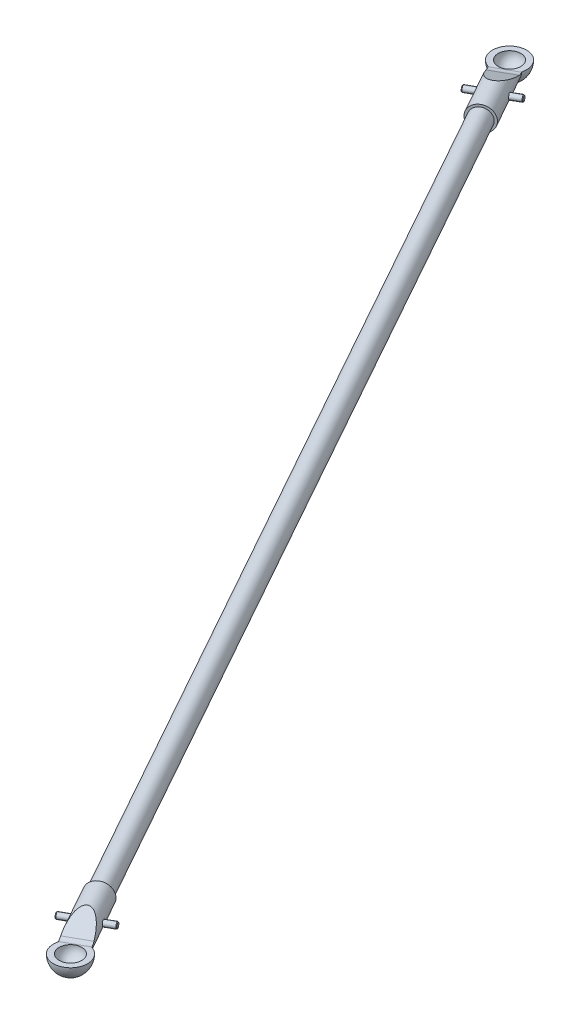
ISO-10303-21;
HEADER;
FILE_DESCRIPTION(('STEP AP214'),'2;1');
FILE_NAME('part.step','',(''),(''),'','','');
FILE_SCHEMA(('AUTOMOTIVE_DESIGN { 1 0 10303 214 1 1 1 1 }'));
ENDSEC;
DATA;
#1=APPLICATION_CONTEXT('core data for automotive mechanical design processes');
#2=APPLICATION_PROTOCOL_DEFINITION('international standard','automotive_design',2000,#1);
#3=PRODUCT_CONTEXT('',#1,'mechanical');
#4=PRODUCT('Part','Part','',(#3));
#5=PRODUCT_RELATED_PRODUCT_CATEGORY('part','',(#4));
#6=PRODUCT_DEFINITION_FORMATION('','',#4);
#7=PRODUCT_DEFINITION_CONTEXT('part definition',#1,'design');
#8=PRODUCT_DEFINITION('design','',#6,#7);
#9=PRODUCT_DEFINITION_SHAPE('','',#8);
#10=(LENGTH_UNIT() NAMED_UNIT(*) SI_UNIT(.MILLI.,.METRE.));
#11=(NAMED_UNIT(*) PLANE_ANGLE_UNIT() SI_UNIT($,.RADIAN.));
#12=(NAMED_UNIT(*) SI_UNIT($,.STERADIAN.) SOLID_ANGLE_UNIT());
#13=UNCERTAINTY_MEASURE_WITH_UNIT(LENGTH_MEASURE(1.E-05),#10,'distance_accuracy_value','');
#14=(GEOMETRIC_REPRESENTATION_CONTEXT(3) GLOBAL_UNCERTAINTY_ASSIGNED_CONTEXT((#13)) GLOBAL_UNIT_ASSIGNED_CONTEXT((#10,
#11,#12)) REPRESENTATION_CONTEXT('',''));
#15=CARTESIAN_POINT('',(0.,0.,0.));
#16=DIRECTION('',(0.,0.,1.));
#17=DIRECTION('',(1.,0.,0.));
#18=AXIS2_PLACEMENT_3D('',#15,#16,#17);
#19=CARTESIAN_POINT('',(45.0999933752008,-50.9999947127485,-973.470500816511));
#20=DIRECTION('',(-0.487374986066847,6.28174157559984E-09,-0.873192775368842));
#21=DIRECTION('',(0.873192775368841,-4.87641980152789E-08,-0.487374986066847));
#22=AXIS2_PLACEMENT_3D('',#19,#20,#21);
#23=CYLINDRICAL_SURFACE('',#22,8.65);
#24=CARTESIAN_POINT('',(70.6871801437103,-50.9999950425399,-927.627880109647));
#25=DIRECTION('',(-0.487374986066847,6.28174157559984E-09,-0.873192775368842));
#26=DIRECTION('',(0.873192775368841,-4.87641980152789E-08,-0.487374986066847));
#27=AXIS2_PLACEMENT_3D('',#24,#25,#26);
#28=CIRCLE('',#27,8.65);
#29=CARTESIAN_POINT('',(78.2402976506508,-50.9999954643502,-931.843673739125));
#30=VERTEX_POINT('',#29);
#31=EDGE_CURVE('P0_E53',#30,#30,#28,.T.);
#32=ORIENTED_EDGE('',*,*,#31,.T.);
#33=EDGE_LOOP('',(#32));
#34=FACE_BOUND('',#33,.T.);
#35=DIRECTION('',(-0.487374986066847,6.28174157559984E-09,-0.873192775368842));
#36=VECTOR('',#35,1.);
#37=CARTESIAN_POINT('',(52.6531108821413,-50.9999951345588,-977.68629444599));
#38=LINE('',#37,#36);
#39=CARTESIAN_POINT('',(56.8383724384136,-50.9999951885023,-970.187878937515));
#40=VERTEX_POINT('',#39);
#41=CARTESIAN_POINT('',(56.7067554605346,-50.9999951868059,-970.423687088293));
#42=VERTEX_POINT('',#41);
#43=EDGE_CURVE('P0_E37',#40,#42,#38,.T.);
#44=ORIENTED_EDGE('',*,*,#43,.F.);
#45=CARTESIAN_POINT('',(58.7107339586362,-50.2050437457864,-966.758202004159));
#46=CARTESIAN_POINT('',(58.6519230387866,-50.2601281611182,-966.873992426591));
#47=CARTESIAN_POINT('',(58.5918617909083,-50.3124703869534,-966.990426955373));
#48=CARTESIAN_POINT('',(58.4695920484234,-50.4115821716905,-967.224530459192));
#49=CARTESIAN_POINT('',(58.4073836022395,-50.4583518561564,-967.342199406349));
#50=CARTESIAN_POINT('',(58.2180281238374,-50.5901978340027,-967.697051367531));
#51=CARTESIAN_POINT('',(58.088184298144,-50.666780089165,-967.936014565995));
#52=CARTESIAN_POINT('',(57.8261527380544,-50.795585420593,-968.413674911189));
#53=CARTESIAN_POINT('',(57.6940394417109,-50.8481909339613,-968.652310914288));
#54=CARTESIAN_POINT('',(57.4274772808251,-50.9305083003875,-969.132054845924));
#55=CARTESIAN_POINT('',(57.2930300818904,-50.9602358449463,-969.373160965045));
#56=CARTESIAN_POINT('',(57.10506175091,-50.9856106499495,-969.710051208476));
#57=CARTESIAN_POINT('',(57.0518690153384,-50.9909936391567,-969.805365241598));
#58=CARTESIAN_POINT('',(56.9452430795453,-50.9981914896029,-969.996408079282));
#59=CARTESIAN_POINT('',(56.8918096662581,-50.9999944785431,-970.092137212299));
#60=CARTESIAN_POINT('',(56.8383724384136,-50.9999951885023,-970.187878937515));
#61=B_SPLINE_CURVE_WITH_KNOTS('',3,(#45,#46,#47,#48,#49,#50,#51,#52,#53,#54,#55,#56,#57,#58,#59,
#60),.UNSPECIFIED.,.F.,.F.,(4,2,2,2,2,2,2,4),(0.,0.423133087806717,0.846256639519644,
1.69274082725032,2.52520527690246,3.35709824718313,3.68490727157546,4.01380160023117),.UNSPECIFIED.);
#62=CARTESIAN_POINT('',(58.7107339586362,-50.2050437457864,-966.758202004159));
#63=VERTEX_POINT('',#62);
#64=EDGE_CURVE('P0_E25',#63,#40,#61,.T.);
#65=ORIENTED_EDGE('',*,*,#64,.F.);
#66=CARTESIAN_POINT('',(50.2768305474421,-50.9999947794724,-964.195554528148));
#67=DIRECTION('',(-0.190432536289561,0.920504855906911,-0.341183615336556));
#68=DIRECTION('',(-0.448631057959641,-0.3907311227069,-0.80377818058356));
#69=AXIS2_PLACEMENT_3D('',#66,#67,#68);
#70=ELLIPSE('',#69,22.1379853543904,8.65);
#71=CARTESIAN_POINT('',(43.6684275429436,-50.2050429057359,-958.36229667081));
#72=VERTEX_POINT('',#71);
#73=EDGE_CURVE('P0_E62',#72,#63,#70,.T.);
#74=ORIENTED_EDGE('',*,*,#73,.F.);
#75=CARTESIAN_POINT('',(41.7321374245327,-50.9999943448817,-961.756291678559));
#76=CARTESIAN_POINT('',(41.8008894884692,-50.9999940396881,-961.633123823543));
#77=CARTESIAN_POINT('',(41.8696237049313,-50.99700923562,-961.509966620842));
#78=CARTESIAN_POINT('',(42.0069887747402,-50.9850776532978,-961.263881702194));
#79=CARTESIAN_POINT('',(42.0756196268604,-50.9761308048418,-961.140953988967));
#80=CARTESIAN_POINT('',(42.2813154485149,-50.9403470054942,-960.77272028693));
#81=CARTESIAN_POINT('',(42.4181211239722,-50.9045668112656,-960.528075967531));
#82=CARTESIAN_POINT('',(42.6884425154102,-50.8102327761976,-960.046966579548));
#83=CARTESIAN_POINT('',(42.8219749640065,-50.752070277859,-959.810433146439));
#84=CARTESIAN_POINT('',(43.0882833400432,-50.6133943728722,-959.343751119846));
#85=CARTESIAN_POINT('',(43.2210597591028,-50.5328977355128,-959.113597877934));
#86=CARTESIAN_POINT('',(43.4061103519268,-50.4055471433689,-958.798968186177));
#87=CARTESIAN_POINT('',(43.4584179765678,-50.3678595375368,-958.710716627272));
#88=CARTESIAN_POINT('',(43.5632699587902,-50.2890217906158,-958.535456457998));
#89=CARTESIAN_POINT('',(43.6158145231108,-50.2478604929725,-958.448452990492));
#90=CARTESIAN_POINT('',(43.6684275429436,-50.2050429057359,-958.36229667081));
#91=B_SPLINE_CURVE_WITH_KNOTS('',3,(#75,#76,#77,#78,#79,#80,#81,#82,#83,#84,#85,#86,#87,#88,#89,
#90),.UNSPECIFIED.,.F.,.F.,(4,2,2,2,2,2,2,4),(0.,0.423104430557231,0.846213843174125,
1.69281689678877,2.52524481128818,3.35704939200992,3.68487734143039,4.01380147317455),.UNSPECIFIED.);
#92=CARTESIAN_POINT('',(41.7321374245327,-50.9999943448817,-961.756291678559));
#93=VERTEX_POINT('',#92);
#94=EDGE_CURVE('P0_E11',#93,#72,#91,.T.);
#95=ORIENTED_EDGE('',*,*,#94,.F.);
#96=DIRECTION('',(-0.487374986066847,6.28174157559984E-09,-0.873192775368842));
#97=VECTOR('',#96,1.);
#98=CARTESIAN_POINT('',(37.5468758682603,-50.9999942909382,-969.254707187033));
#99=LINE('',#98,#97);
#100=CARTESIAN_POINT('',(41.6005204466537,-50.9999943431853,-961.992099829337));
#101=VERTEX_POINT('',#100);
#102=EDGE_CURVE('P0_E55',#101,#93,#99,.F.);
#103=ORIENTED_EDGE('',*,*,#102,.F.);
#104=CARTESIAN_POINT('',(49.1536379535942,-50.9999947649956,-966.207893458815));
#105=DIRECTION('',(-0.487374986066847,6.28174157559984E-09,-0.873192775368842));
#106=DIRECTION('',(0.873192775368841,-4.87641980152789E-08,-0.487374986066847));
#107=AXIS2_PLACEMENT_3D('',#104,#105,#106);
#108=CIRCLE('',#107,8.65);
#109=EDGE_CURVE('P0_E49',#42,#101,#108,.T.);
#110=ORIENTED_EDGE('',*,*,#109,.F.);
#111=EDGE_LOOP('',(#44,#65,#74,#95,#103,#110));
#112=FACE_BOUND('',#111,.T.);
#113=ADVANCED_FACE('P0_F16',(#34,#112),#23,.T.);
#114=CARTESIAN_POINT('',(45.0999933752008,-50.9999947127485,-973.470500816511));
#115=DIRECTION('',(-0.487374986066847,6.28174157559984E-09,-0.873192775368842));
#116=DIRECTION('',(-4.56421091096178E-08,-1.,1.82812789800053E-08));
#117=AXIS2_PLACEMENT_3D('',#114,#115,#116);
#118=SPHERICAL_SURFACE('',#117,12.);
#119=CARTESIAN_POINT('',(45.0999933752008,-50.9999947127485,-973.470500816511));
#120=DIRECTION('',(4.56421091096178E-08,1.,-1.82812789800053E-08));
#121=DIRECTION('',(-0.487374986066847,6.28174157559984E-09,-0.873192775368842));
#122=AXIS2_PLACEMENT_3D('',#119,#120,#121);
#123=CIRCLE('',#122,12.);
#124=EDGE_CURVE('P0_E52',#42,#101,#123,.T.);
#125=ORIENTED_EDGE('',*,*,#124,.F.);
#126=ORIENTED_EDGE('',*,*,#109,.T.);
#127=EDGE_LOOP('',(#125,#126));
#128=FACE_BOUND('',#127,.T.);
#129=ADVANCED_FACE('P0_F50',(#128),#118,.T.);
#130=CARTESIAN_POINT('',(70.6871801437103,-50.9999950425399,-927.627880109647));
#131=DIRECTION('',(-0.487374986066847,6.28174157559984E-09,-0.873192775368842));
#132=DIRECTION('',(0.873192775368841,-4.87641980152789E-08,-0.487374986066847));
#133=AXIS2_PLACEMENT_3D('',#130,#131,#132);
#134=PLANE('',#133);
#135=ORIENTED_EDGE('',*,*,#31,.F.);
#136=EDGE_LOOP('',(#135));
#137=FACE_BOUND('',#136,.T.);
#138=ADVANCED_FACE('P0_F18',(#137),#134,.F.);
#139=CARTESIAN_POINT('',(-39.7096612712858,-40.9999897966947,-916.299324228634));
#140=DIRECTION('',(0.873192775368841,-4.87641980152789E-08,-0.487374986066847));
#141=DIRECTION('',(4.56421091096178E-08,1.,-1.82812789800053E-08));
#142=AXIS2_PLACEMENT_3D('',#139,#140,#141);
#143=CYLINDRICAL_SURFACE('',#142,10.);
#144=DIRECTION('',(0.873192775368841,-4.87641980152789E-08,-0.487374986066847));
#145=VECTOR('',#144,1.);
#146=CARTESIAN_POINT('',(-39.7096617277069,-50.9999897966947,-916.299324045821));
#147=LINE('',#146,#145);
#148=EDGE_CURVE('P0_E59',#93,#40,#147,.T.);
#149=ORIENTED_EDGE('',*,*,#148,.F.);
#150=ORIENTED_EDGE('',*,*,#94,.T.);
#151=DIRECTION('',(0.873192775368841,-4.87641980152789E-08,-0.487374986066847));
#152=VECTOR('',#151,1.);
#153=CARTESIAN_POINT('',(-37.8053359083901,-50.2050383557638,-912.887488075269));
#154=LINE('',#153,#152);
#155=EDGE_CURVE('P0_E154',#72,#63,#154,.T.);
#156=ORIENTED_EDGE('',*,*,#155,.T.);
#157=ORIENTED_EDGE('',*,*,#64,.T.);
#158=EDGE_LOOP('',(#149,#150,#156,#157));
#159=FACE_BOUND('',#158,.T.);
#160=ADVANCED_FACE('P0_F80',(#159),#143,.F.);
#161=CARTESIAN_POINT('',(-37.8053359083901,-50.2050383557638,-912.887488075269));
#162=DIRECTION('',(-0.190432536289561,0.920504855906911,-0.341183615336556));
#163=DIRECTION('',(-0.448631057959641,-0.3907311227069,-0.80377818058356));
#164=AXIS2_PLACEMENT_3D('',#161,#162,#163);
#165=PLANE('',#164);
#166=ORIENTED_EDGE('',*,*,#155,.F.);
#167=ORIENTED_EDGE('',*,*,#73,.T.);
#168=EDGE_LOOP('',(#166,#167));
#169=FACE_BOUND('',#168,.T.);
#170=ADVANCED_FACE('P0_F85',(#169),#165,.T.);
#171=CARTESIAN_POINT('',(-53.3393356937434,-50.9999896210228,-940.718576526997));
#172=DIRECTION('',(4.56421091096178E-08,1.,-1.82812789800053E-08));
#173=DIRECTION('',(-0.487374986066847,6.28174157559984E-09,-0.873192775368842));
#174=AXIS2_PLACEMENT_3D('',#171,#172,#173);
#175=PLANE('',#174);
#176=CARTESIAN_POINT('',(45.0999933752008,-50.9999947127485,-973.470500816511));
#177=DIRECTION('',(4.56421091096178E-08,1.,-1.82812789800053E-08));
#178=DIRECTION('',(-0.487374986066847,6.28174157559984E-09,-0.873192775368842));
#179=AXIS2_PLACEMENT_3D('',#176,#177,#178);
#180=CIRCLE('',#179,7.97226838534743);
#181=CARTESIAN_POINT('',(41.2145091819709,-50.9999946626688,-980.431827973898));
#182=VERTEX_POINT('',#181);
#183=EDGE_CURVE('P0_E20',#182,#182,#180,.T.);
#184=ORIENTED_EDGE('',*,*,#183,.F.);
#185=EDGE_LOOP('',(#184));
#186=FACE_BOUND('',#185,.T.);
#187=ORIENTED_EDGE('',*,*,#148,.T.);
#188=ORIENTED_EDGE('',*,*,#43,.T.);
#189=ORIENTED_EDGE('',*,*,#124,.T.);
#190=ORIENTED_EDGE('',*,*,#102,.T.);
#191=EDGE_LOOP('',(#187,#188,#189,#190));
#192=FACE_BOUND('',#191,.T.);
#193=ADVANCED_FACE('P0_F61',(#186,#192),#175,.T.);
#194=CARTESIAN_POINT('',(45.0999933752008,-50.9999947127485,-973.470500816511));
#195=DIRECTION('',(-4.56421091679879E-08,-1.,1.8281278875428E-08));
#196=DIRECTION('',(0.487374986066847,-6.28174169536402E-09,0.873192775368842));
#197=AXIS2_PLACEMENT_3D('',#194,#195,#196);
#198=SPHERICAL_SURFACE('',#197,7.97226838534743);
#199=ORIENTED_EDGE('',*,*,#183,.T.);
#200=EDGE_LOOP('',(#199));
#201=FACE_BOUND('',#200,.T.);
#202=ADVANCED_FACE('P0_F90',(#201),#198,.F.);
#203=CLOSED_SHELL('',(#113,#129,#138,#160,#170,#193,#202));
#204=MANIFOLD_SOLID_BREP('P0_B1',#203);
#205=CARTESIAN_POINT('',(44.9161016188721,-50.9999941102235,-940.971034287157));
#206=DIRECTION('',(-0.873192775368841,4.87641978978793E-08,0.487374986066847));
#207=DIRECTION('',(4.56421090071054E-08,1.,-1.82812789227877E-08));
#208=AXIS2_PLACEMENT_3D('',#205,#206,#207);
#209=PLANE('',#208);
#210=CARTESIAN_POINT('',(45.7501585513048,-50.9999941209736,-939.476717778376));
#211=DIRECTION('',(0.873192775368841,-4.87641978978793E-08,-0.487374986066847));
#212=DIRECTION('',(-4.56421090071054E-08,-1.,1.82812789227877E-08));
#213=AXIS2_PLACEMENT_3D('',#210,#211,#212);
#214=CIRCLE('',#213,1.71132486540518);
#215=CARTESIAN_POINT('',(45.7501584731963,-52.7113189863788,-939.476717747091));
#216=VERTEX_POINT('',#215);
#217=EDGE_CURVE('P1_E28',#216,#216,#214,.T.);
#218=ORIENTED_EDGE('',*,*,#217,.F.);
#219=EDGE_LOOP('',(#218));
#220=FACE_BOUND('',#219,.T.);
#221=ADVANCED_FACE('P1_F14',(#220),#209,.T.);
#222=CARTESIAN_POINT('',(72.858270430675,-50.9999956706778,-956.567033841296));
#223=DIRECTION('',(-0.873192775368841,4.87641978978793E-08,0.487374986066847));
#224=DIRECTION('',(4.56421090071054E-08,1.,-1.82812789227877E-08));
#225=AXIS2_PLACEMENT_3D('',#222,#223,#224);
#226=PLANE('',#225);
#227=CARTESIAN_POINT('',(73.6923273631077,-50.9999956814279,-955.072717332516));
#228=DIRECTION('',(0.873192775368841,-4.87641978978793E-08,-0.487374986066847));
#229=DIRECTION('',(-4.56421090071054E-08,-1.,1.82812789227877E-08));
#230=AXIS2_PLACEMENT_3D('',#227,#228,#229);
#231=CIRCLE('',#230,1.71132486540518);
#232=CARTESIAN_POINT('',(73.6923272849992,-52.7113205468331,-955.072717301231));
#233=VERTEX_POINT('',#232);
#234=EDGE_CURVE('P1_E10',#233,#233,#231,.T.);
#235=ORIENTED_EDGE('',*,*,#234,.T.);
#236=EDGE_LOOP('',(#235));
#237=FACE_BOUND('',#236,.T.);
#238=ADVANCED_FACE('P1_F38',(#237),#226,.F.);
#239=CARTESIAN_POINT('',(73.2557309754233,-50.9999956570458,-954.829029839482));
#240=DIRECTION('',(-0.873192775368841,4.87641978978793E-08,0.487374986066847));
#241=DIRECTION('',(4.56421090071054E-08,1.,-1.82812789227877E-08));
#242=AXIS2_PLACEMENT_3D('',#239,#240,#241);
#243=CONICAL_SURFACE('',#242,2.,0.523598775598299);
#244=ORIENTED_EDGE('',*,*,#234,.F.);
#245=EDGE_LOOP('',(#244));
#246=FACE_BOUND('',#245,.T.);
#247=CARTESIAN_POINT('',(73.2557309754233,-50.9999956570458,-954.829029839482));
#248=DIRECTION('',(0.873192775368841,-4.87641978978793E-08,-0.487374986066847));
#249=DIRECTION('',(-4.56421090071054E-08,-1.,1.82812789227877E-08));
#250=AXIS2_PLACEMENT_3D('',#247,#248,#249);
#251=CIRCLE('',#250,2.);
#252=CARTESIAN_POINT('',(73.2557308841391,-52.9999956570458,-954.82902980292));
#253=VERTEX_POINT('',#252);
#254=EDGE_CURVE('P1_E20',#253,#253,#251,.T.);
#255=ORIENTED_EDGE('',*,*,#254,.T.);
#256=EDGE_LOOP('',(#255));
#257=FACE_BOUND('',#256,.T.);
#258=ADVANCED_FACE('P1_F43',(#246,#257),#243,.T.);
#259=CARTESIAN_POINT('',(59.7212429572062,-50.9999949012007,-947.274717555446));
#260=DIRECTION('',(0.873192775368841,-4.87641978978793E-08,-0.487374986066847));
#261=DIRECTION('',(-4.56421090071054E-08,-1.,1.82812789227877E-08));
#262=AXIS2_PLACEMENT_3D('',#259,#260,#261);
#263=CYLINDRICAL_SURFACE('',#262,2.);
#264=CARTESIAN_POINT('',(46.1867549389892,-50.9999941453557,-939.72040527141));
#265=DIRECTION('',(0.873192775368841,-4.87641978978793E-08,-0.487374986066847));
#266=DIRECTION('',(-4.56421090071054E-08,-1.,1.82812789227877E-08));
#267=AXIS2_PLACEMENT_3D('',#264,#265,#266);
#268=CIRCLE('',#267,2.);
#269=CARTESIAN_POINT('',(46.186754847705,-52.9999941453557,-939.720405234847));
#270=VERTEX_POINT('',#269);
#271=EDGE_CURVE('P1_E24',#270,#270,#268,.T.);
#272=ORIENTED_EDGE('',*,*,#271,.T.);
#273=EDGE_LOOP('',(#272));
#274=FACE_BOUND('',#273,.T.);
#275=ORIENTED_EDGE('',*,*,#254,.F.);
#276=EDGE_LOOP('',(#275));
#277=FACE_BOUND('',#276,.T.);
#278=ADVANCED_FACE('P1_F47',(#274,#277),#263,.T.);
#279=CARTESIAN_POINT('',(46.1867549389892,-50.9999941453557,-939.72040527141));
#280=DIRECTION('',(0.873192775368841,-4.87641978978793E-08,-0.487374986066847));
#281=DIRECTION('',(-4.56421090071054E-08,-1.,1.82812789227877E-08));
#282=AXIS2_PLACEMENT_3D('',#279,#280,#281);
#283=CONICAL_SURFACE('',#282,2.,0.523598775598299);
#284=ORIENTED_EDGE('',*,*,#217,.T.);
#285=EDGE_LOOP('',(#284));
#286=FACE_BOUND('',#285,.T.);
#287=ORIENTED_EDGE('',*,*,#271,.F.);
#288=EDGE_LOOP('',(#287));
#289=FACE_BOUND('',#288,.T.);
#290=ADVANCED_FACE('P1_F34',(#286,#289),#283,.T.);
#291=CLOSED_SHELL('',(#221,#238,#258,#278,#290));
#292=MANIFOLD_SOLID_BREP('P1_B1',#291);
#293=CARTESIAN_POINT('',(434.999982228679,-50.9999997381417,-274.916280521437));
#294=DIRECTION('',(0.487374986066847,-6.28174173119239E-09,0.873192775368842));
#295=DIRECTION('',(-0.873192775368841,4.87641980631369E-08,0.487374986066847));
#296=AXIS2_PLACEMENT_3D('',#293,#294,#295);
#297=CYLINDRICAL_SURFACE('',#296,8.65);
#298=CARTESIAN_POINT('',(409.412795460169,-50.9999994083503,-320.758901228302));
#299=DIRECTION('',(0.487374986066847,-6.28174173119239E-09,0.873192775368842));
#300=DIRECTION('',(-0.873192775368841,4.87641980631369E-08,0.487374986066847));
#301=AXIS2_PLACEMENT_3D('',#298,#299,#300);
#302=CIRCLE('',#301,8.65);
#303=CARTESIAN_POINT('',(401.859677953229,-50.99999898654,-316.543107598824));
#304=VERTEX_POINT('',#303);
#305=EDGE_CURVE('P2_E53',#304,#304,#302,.T.);
#306=ORIENTED_EDGE('',*,*,#305,.T.);
#307=EDGE_LOOP('',(#306));
#308=FACE_BOUND('',#307,.T.);
#309=DIRECTION('',(0.487374986066847,-6.28174173119239E-09,0.873192775368842));
#310=VECTOR('',#309,1.);
#311=CARTESIAN_POINT('',(427.446864721738,-50.9999993163314,-270.70048689196));
#312=LINE('',#311,#310);
#313=CARTESIAN_POINT('',(423.261603165465,-50.9999992623879,-278.198902400434));
#314=VERTEX_POINT('',#313);
#315=CARTESIAN_POINT('',(423.393220143345,-50.9999992640843,-277.963094249656));
#316=VERTEX_POINT('',#315);
#317=EDGE_CURVE('P2_E37',#314,#316,#312,.T.);
#318=ORIENTED_EDGE('',*,*,#317,.F.);
#319=CARTESIAN_POINT('',(421.38924171781,-50.2050477741526,-281.628579362856));
#320=CARTESIAN_POINT('',(421.448052632631,-50.2601321906193,-281.51278893841));
#321=CARTESIAN_POINT('',(421.508113875731,-50.31247441768,-281.396354407713));
#322=CARTESIAN_POINT('',(421.630383609169,-50.4115862050191,-281.162250900271));
#323=CARTESIAN_POINT('',(421.692592051083,-50.4583558908613,-281.044581951404));
#324=CARTESIAN_POINT('',(421.88194751745,-50.5902018730185,-280.689729985402));
#325=CARTESIAN_POINT('',(422.011791336152,-50.6667841312963,-280.450766784137));
#326=CARTESIAN_POINT('',(422.273822884484,-50.7955894691792,-279.973106434234));
#327=CARTESIAN_POINT('',(422.405936176025,-50.8481949858822,-279.734470429212));
#328=CARTESIAN_POINT('',(422.672498329397,-50.9305123591007,-279.254726494566));
#329=CARTESIAN_POINT('',(422.806945525618,-50.960239907117,-279.013620374358));
#330=CARTESIAN_POINT('',(422.994913854282,-50.9856147169611,-278.676730129999));
#331=CARTESIAN_POINT('',(423.048106589363,-50.9909977075391,-278.58141609668));
#332=CARTESIAN_POINT('',(423.154732524498,-50.9981955607335,-278.390373258732));
#333=CARTESIAN_POINT('',(423.208165937621,-50.9999985510512,-278.29464412565));
#334=CARTESIAN_POINT('',(423.261603165465,-50.9999992623879,-278.198902400434));
#335=B_SPLINE_CURVE_WITH_KNOTS('',3,(#319,#320,#321,#322,#323,#324,#325,#326,#327,#328,#329,
#330,#331,#332,#333,#334),.UNSPECIFIED.,.F.,.F.,(4,2,2,2,2,2,2,4),(0.,0.423133087806727,
0.846256639519677,1.69274082725022,2.52520527690233,3.35709824718297,3.68490727157572,
4.01380160023164),.UNSPECIFIED.);
#336=CARTESIAN_POINT('',(421.38924171781,-50.2050477741526,-281.628579362856));
#337=VERTEX_POINT('',#336);
#338=EDGE_CURVE('P2_E25',#337,#314,#335,.T.);
#339=ORIENTED_EDGE('',*,*,#338,.F.);
#340=CARTESIAN_POINT('',(429.823145056437,-50.9999996714178,-284.191226809802));
#341=DIRECTION('',(0.190432620317126,0.920504850997967,0.341183581680544));
#342=DIRECTION('',(0.448631022292055,-0.390731134271648,0.80377819486969));
#343=AXIS2_PLACEMENT_3D('',#340,#341,#342);
#344=ELLIPSE('',#343,22.1379853543904,8.65);
#345=CARTESIAN_POINT('',(436.431548133502,-50.2050486142031,-290.024484696205));
#346=VERTEX_POINT('',#345);
#347=EDGE_CURVE('P2_E62',#346,#337,#344,.T.);
#348=ORIENTED_EDGE('',*,*,#347,.F.);
#349=CARTESIAN_POINT('',(438.367838179347,-51.0000001060085,-286.63048965939));
#350=CARTESIAN_POINT('',(438.29908611541,-50.9999997990422,-286.753657514406));
#351=CARTESIAN_POINT('',(438.23035189922,-50.9970149932028,-286.876814717216));
#352=CARTESIAN_POINT('',(438.092986830501,-50.9850834073388,-287.1228996363));
#353=CARTESIAN_POINT('',(438.024355979197,-50.9761365571124,-287.245827349854));
#354=CARTESIAN_POINT('',(437.818660160809,-50.9403527524516,-287.6140610532));
#355=CARTESIAN_POINT('',(437.681854488618,-50.9045725546796,-287.858705373907));
#356=CARTESIAN_POINT('',(437.411533105791,-50.8102385125261,-288.339814765339));
#357=CARTESIAN_POINT('',(437.278000662504,-50.7520760106464,-288.576348200575));
#358=CARTESIAN_POINT('',(437.011692299126,-50.613400098413,-289.043030232238));
#359=CARTESIAN_POINT('',(436.878915887415,-50.5329034573483,-289.273183477094));
#360=CARTESIAN_POINT('',(436.693865306216,-50.4055528598158,-289.587813173507));
#361=CARTESIAN_POINT('',(436.641557685015,-50.3678652524354,-289.67606473379));
#362=CARTESIAN_POINT('',(436.536705709989,-50.2890275023509,-289.851324905946));
#363=CARTESIAN_POINT('',(436.484161149426,-50.2478662030922,-289.938328374957));
#364=CARTESIAN_POINT('',(436.431548133502,-50.2050486142031,-290.024484696205));
#365=B_SPLINE_CURVE_WITH_KNOTS('',3,(#349,#350,#351,#352,#353,#354,#355,#356,#357,#358,#359,
#360,#361,#362,#363,#364),.UNSPECIFIED.,.F.,.F.,(4,2,2,2,2,2,2,4),(0.,0.423104430557207,
0.846213843174073,1.69281689678882,2.52524481128829,3.35704939201012,3.68487734143073,
4.01380147317503),.UNSPECIFIED.);
#366=CARTESIAN_POINT('',(438.367838179347,-51.0000001060085,-286.63048965939));
#367=VERTEX_POINT('',#366);
#368=EDGE_CURVE('P2_E11',#367,#346,#365,.T.);
#369=ORIENTED_EDGE('',*,*,#368,.F.);
#370=DIRECTION('',(0.487374986066847,-6.28174173119239E-09,0.873192775368842));
#371=VECTOR('',#370,1.);
#372=CARTESIAN_POINT('',(442.553099735619,-51.000000159952,-279.132074150916));
#373=LINE('',#372,#371);
#374=CARTESIAN_POINT('',(438.499455157225,-51.0000001077049,-286.394681508612));
#375=VERTEX_POINT('',#374);
#376=EDGE_CURVE('P2_E55',#375,#367,#373,.F.);
#377=ORIENTED_EDGE('',*,*,#376,.F.);
#378=CARTESIAN_POINT('',(430.946337650285,-50.9999996858946,-282.178887879134));
#379=DIRECTION('',(0.487374986066847,-6.28174173119239E-09,0.873192775368842));
#380=DIRECTION('',(-0.873192775368841,4.87641980631369E-08,0.487374986066847));
#381=AXIS2_PLACEMENT_3D('',#378,#379,#380);
#382=CIRCLE('',#381,8.65);
#383=EDGE_CURVE('P2_E49',#316,#375,#382,.T.);
#384=ORIENTED_EDGE('',*,*,#383,.F.);
#385=EDGE_LOOP('',(#318,#339,#348,#369,#377,#384));
#386=FACE_BOUND('',#385,.T.);
#387=ADVANCED_FACE('P2_F16',(#308,#386),#297,.T.);
#388=CARTESIAN_POINT('',(434.999982228679,-50.9999997381417,-274.916280521437));
#389=DIRECTION('',(0.487374986066847,-6.28174173119239E-09,0.873192775368842));
#390=DIRECTION('',(-4.5642109227239E-08,-1.,1.82812788674677E-08));
#391=AXIS2_PLACEMENT_3D('',#388,#389,#390);
#392=SPHERICAL_SURFACE('',#391,12.);
#393=CARTESIAN_POINT('',(434.999982228679,-50.9999997381417,-274.916280521437));
#394=DIRECTION('',(4.56421092272389E-08,1.,-1.82812788674677E-08));
#395=DIRECTION('',(0.487374986066847,-6.28174173119239E-09,0.873192775368842));
#396=AXIS2_PLACEMENT_3D('',#393,#394,#395);
#397=CIRCLE('',#396,12.);
#398=EDGE_CURVE('P2_E52',#316,#375,#397,.T.);
#399=ORIENTED_EDGE('',*,*,#398,.F.);
#400=ORIENTED_EDGE('',*,*,#383,.T.);
#401=EDGE_LOOP('',(#399,#400));
#402=FACE_BOUND('',#401,.T.);
#403=ADVANCED_FACE('P2_F50',(#402),#392,.T.);
#404=CARTESIAN_POINT('',(409.412795460169,-50.9999994083503,-320.758901228302));
#405=DIRECTION('',(0.487374986066847,-6.28174173119239E-09,0.873192775368842));
#406=DIRECTION('',(-0.873192775368841,4.87641980631369E-08,0.487374986066847));
#407=AXIS2_PLACEMENT_3D('',#404,#405,#406);
#408=PLANE('',#407);
#409=ORIENTED_EDGE('',*,*,#305,.F.);
#410=EDGE_LOOP('',(#409));
#411=FACE_BOUND('',#410,.T.);
#412=ADVANCED_FACE('P2_F18',(#411),#408,.F.);
#413=CARTESIAN_POINT('',(519.809637788007,-41.0000046541955,-332.08745747494));
#414=DIRECTION('',(-0.873192775368841,4.87641980631368E-08,0.487374986066847));
#415=DIRECTION('',(4.5642109227239E-08,1.,-1.82812788674677E-08));
#416=AXIS2_PLACEMENT_3D('',#413,#414,#415);
#417=CYLINDRICAL_SURFACE('',#416,10.);
#418=DIRECTION('',(-0.873192775368841,4.87641980631368E-08,0.487374986066847));
#419=VECTOR('',#418,1.);
#420=CARTESIAN_POINT('',(519.809637331586,-51.0000046541955,-332.087457292127));
#421=LINE('',#420,#419);
#422=EDGE_CURVE('P2_E59',#367,#314,#421,.T.);
#423=ORIENTED_EDGE('',*,*,#422,.F.);
#424=ORIENTED_EDGE('',*,*,#368,.T.);
#425=DIRECTION('',(-0.873192775368841,4.87641980631368E-08,0.487374986066847));
#426=VECTOR('',#425,1.);
#427=CARTESIAN_POINT('',(517.905311584836,-50.2050531641752,-335.499293291746));
#428=LINE('',#427,#426);
#429=EDGE_CURVE('P2_E154',#346,#337,#428,.T.);
#430=ORIENTED_EDGE('',*,*,#429,.T.);
#431=ORIENTED_EDGE('',*,*,#338,.T.);
#432=EDGE_LOOP('',(#423,#424,#430,#431));
#433=FACE_BOUND('',#432,.T.);
#434=ADVANCED_FACE('P2_F80',(#433),#417,.F.);
#435=CARTESIAN_POINT('',(517.905311584836,-50.2050531641752,-335.499293291746));
#436=DIRECTION('',(0.190432620317126,0.920504850997967,0.341183581680544));
#437=DIRECTION('',(0.448631022292055,-0.390731134271648,0.80377819486969));
#438=AXIS2_PLACEMENT_3D('',#435,#436,#437);
#439=PLANE('',#438);
#440=ORIENTED_EDGE('',*,*,#429,.F.);
#441=ORIENTED_EDGE('',*,*,#347,.T.);
#442=EDGE_LOOP('',(#440,#441));
#443=FACE_BOUND('',#442,.T.);
#444=ADVANCED_FACE('P2_F85',(#443),#439,.T.);
#445=CARTESIAN_POINT('',(533.439311297623,-51.0000048298674,-307.668204810952));
#446=DIRECTION('',(4.56421092272389E-08,1.,-1.82812788674677E-08));
#447=DIRECTION('',(0.487374986066847,-6.28174173119239E-09,0.873192775368842));
#448=AXIS2_PLACEMENT_3D('',#445,#446,#447);
#449=PLANE('',#448);
#450=CARTESIAN_POINT('',(434.999982228679,-50.9999997381417,-274.916280521437));
#451=DIRECTION('',(4.56421092272389E-08,1.,-1.82812788674677E-08));
#452=DIRECTION('',(0.487374986066847,-6.28174173119239E-09,0.873192775368842));
#453=AXIS2_PLACEMENT_3D('',#450,#451,#452);
#454=CIRCLE('',#453,7.97226838534743);
#455=CARTESIAN_POINT('',(438.885466421908,-50.9999997882214,-267.954953364051));
#456=VERTEX_POINT('',#455);
#457=EDGE_CURVE('P2_E20',#456,#456,#454,.T.);
#458=ORIENTED_EDGE('',*,*,#457,.F.);
#459=EDGE_LOOP('',(#458));
#460=FACE_BOUND('',#459,.T.);
#461=ORIENTED_EDGE('',*,*,#422,.T.);
#462=ORIENTED_EDGE('',*,*,#317,.T.);
#463=ORIENTED_EDGE('',*,*,#398,.T.);
#464=ORIENTED_EDGE('',*,*,#376,.T.);
#465=EDGE_LOOP('',(#461,#462,#463,#464));
#466=FACE_BOUND('',#465,.T.);
#467=ADVANCED_FACE('P2_F61',(#460,#466),#449,.T.);
#468=CARTESIAN_POINT('',(434.999982228679,-50.9999997381417,-274.916280521437));
#469=DIRECTION('',(-4.56421091688689E-08,-1.,1.82812789720449E-08));
#470=DIRECTION('',(-0.487374986066847,6.28174161142821E-09,-0.873192775368842));
#471=AXIS2_PLACEMENT_3D('',#468,#469,#470);
#472=SPHERICAL_SURFACE('',#471,7.97226838534743);
#473=ORIENTED_EDGE('',*,*,#457,.T.);
#474=EDGE_LOOP('',(#473));
#475=FACE_BOUND('',#474,.T.);
#476=ADVANCED_FACE('P2_F90',(#475),#472,.F.);
#477=CLOSED_SHELL('',(#387,#403,#412,#434,#444,#467,#476));
#478=MANIFOLD_SOLID_BREP('P2_B1',#477);
#479=CARTESIAN_POINT('',(435.183873985007,-51.0000003406668,-307.415747050791));
#480=DIRECTION('',(0.873192775368841,-4.87641981805364E-08,-0.487374986066847));
#481=DIRECTION('',(4.56421093297514E-08,1.,-1.82812789246854E-08));
#482=AXIS2_PLACEMENT_3D('',#479,#480,#481);
#483=PLANE('',#482);
#484=CARTESIAN_POINT('',(434.349817052575,-51.0000003299167,-308.910063559573));
#485=DIRECTION('',(-0.873192775368841,4.87641981805364E-08,0.487374986066847));
#486=DIRECTION('',(-4.56421093297514E-08,-1.,1.82812789246854E-08));
#487=AXIS2_PLACEMENT_3D('',#484,#485,#486);
#488=CIRCLE('',#487,1.71132486540518);
#489=CARTESIAN_POINT('',(434.349816974466,-52.7113251953219,-308.910063528287));
#490=VERTEX_POINT('',#489);
#491=EDGE_CURVE('P3_E28',#490,#490,#488,.T.);
#492=ORIENTED_EDGE('',*,*,#491,.F.);
#493=EDGE_LOOP('',(#492));
#494=FACE_BOUND('',#493,.T.);
#495=ADVANCED_FACE('P3_F14',(#494),#483,.T.);
#496=CARTESIAN_POINT('',(407.241705173205,-50.9999987802124,-291.819747496652));
#497=DIRECTION('',(0.873192775368841,-4.87641981805364E-08,-0.487374986066847));
#498=DIRECTION('',(4.56421093297514E-08,1.,-1.82812789246854E-08));
#499=AXIS2_PLACEMENT_3D('',#496,#497,#498);
#500=PLANE('',#499);
#501=CARTESIAN_POINT('',(406.407648240772,-50.9999987694623,-293.314064005433));
#502=DIRECTION('',(-0.873192775368841,4.87641981805364E-08,0.487374986066847));
#503=DIRECTION('',(-4.56421093297514E-08,-1.,1.82812789246854E-08));
#504=AXIS2_PLACEMENT_3D('',#501,#502,#503);
#505=CIRCLE('',#504,1.71132486540518);
#506=CARTESIAN_POINT('',(406.407648162663,-52.7113236348675,-293.314063974148));
#507=VERTEX_POINT('',#506);
#508=EDGE_CURVE('P3_E10',#507,#507,#505,.T.);
#509=ORIENTED_EDGE('',*,*,#508,.T.);
#510=EDGE_LOOP('',(#509));
#511=FACE_BOUND('',#510,.T.);
#512=ADVANCED_FACE('P3_F38',(#511),#500,.F.);
#513=CARTESIAN_POINT('',(406.844244628456,-50.9999987938444,-293.557751498467));
#514=DIRECTION('',(0.873192775368841,-4.87641981805364E-08,-0.487374986066847));
#515=DIRECTION('',(4.56421093297514E-08,1.,-1.82812789246854E-08));
#516=AXIS2_PLACEMENT_3D('',#513,#514,#515);
#517=CONICAL_SURFACE('',#516,2.,0.523598775598299);
#518=ORIENTED_EDGE('',*,*,#508,.F.);
#519=EDGE_LOOP('',(#518));
#520=FACE_BOUND('',#519,.T.);
#521=CARTESIAN_POINT('',(406.844244628456,-50.9999987938444,-293.557751498467));
#522=DIRECTION('',(-0.873192775368841,4.87641981805364E-08,0.487374986066847));
#523=DIRECTION('',(-4.56421093297514E-08,-1.,1.82812789246854E-08));
#524=AXIS2_PLACEMENT_3D('',#521,#522,#523);
#525=CIRCLE('',#524,2.);
#526=CARTESIAN_POINT('',(406.844244537172,-52.9999987938444,-293.557751461904));
#527=VERTEX_POINT('',#526);
#528=EDGE_CURVE('P3_E20',#527,#527,#525,.T.);
#529=ORIENTED_EDGE('',*,*,#528,.T.);
#530=EDGE_LOOP('',(#529));
#531=FACE_BOUND('',#530,.T.);
#532=ADVANCED_FACE('P3_F43',(#520,#531),#517,.T.);
#533=CARTESIAN_POINT('',(420.378732646673,-50.9999995496895,-301.112063782503));
#534=DIRECTION('',(-0.873192775368841,4.87641981805364E-08,0.487374986066847));
#535=DIRECTION('',(-4.56421093297514E-08,-1.,1.82812789246854E-08));
#536=AXIS2_PLACEMENT_3D('',#533,#534,#535);
#537=CYLINDRICAL_SURFACE('',#536,2.);
#538=CARTESIAN_POINT('',(433.91322066489,-51.0000003055346,-308.666376066539));
#539=DIRECTION('',(-0.873192775368841,4.87641981805364E-08,0.487374986066847));
#540=DIRECTION('',(-4.56421093297514E-08,-1.,1.82812789246854E-08));
#541=AXIS2_PLACEMENT_3D('',#538,#539,#540);
#542=CIRCLE('',#541,2.);
#543=CARTESIAN_POINT('',(433.913220573606,-53.0000003055346,-308.666376029977));
#544=VERTEX_POINT('',#543);
#545=EDGE_CURVE('P3_E24',#544,#544,#542,.T.);
#546=ORIENTED_EDGE('',*,*,#545,.T.);
#547=EDGE_LOOP('',(#546));
#548=FACE_BOUND('',#547,.T.);
#549=ORIENTED_EDGE('',*,*,#528,.F.);
#550=EDGE_LOOP('',(#549));
#551=FACE_BOUND('',#550,.T.);
#552=ADVANCED_FACE('P3_F47',(#548,#551),#537,.T.);
#553=CARTESIAN_POINT('',(433.91322066489,-51.0000003055346,-308.666376066539));
#554=DIRECTION('',(-0.873192775368841,4.87641981805364E-08,0.487374986066847));
#555=DIRECTION('',(-4.56421093297514E-08,-1.,1.82812789246854E-08));
#556=AXIS2_PLACEMENT_3D('',#553,#554,#555);
#557=CONICAL_SURFACE('',#556,2.,0.523598775598299);
#558=ORIENTED_EDGE('',*,*,#491,.T.);
#559=EDGE_LOOP('',(#558));
#560=FACE_BOUND('',#559,.T.);
#561=ORIENTED_EDGE('',*,*,#545,.F.);
#562=EDGE_LOOP('',(#561));
#563=FACE_BOUND('',#562,.T.);
#564=ADVANCED_FACE('P3_F34',(#560,#563),#557,.T.);
#565=CLOSED_SHELL('',(#495,#512,#532,#552,#564));
#566=MANIFOLD_SOLID_BREP('P3_B1',#565);
#567=CARTESIAN_POINT('',(61.4270554084402,-50.9999949231868,-944.218542841655));
#568=DIRECTION('',(0.487374986066847,-6.28174159741239E-09,0.873192775368842));
#569=DIRECTION('',(4.56421091202487E-08,1.,-1.82812789609587E-08));
#570=AXIS2_PLACEMENT_3D('',#567,#568,#569);
#571=CYLINDRICAL_SURFACE('',#570,7.);
#572=CARTESIAN_POINT('',(61.4270554084402,-50.9999949231868,-944.218542841655));
#573=DIRECTION('',(-0.487374986066847,6.28174159741239E-09,-0.873192775368842));
#574=DIRECTION('',(-4.56421091202487E-08,-1.,1.82812789609587E-08));
#575=AXIS2_PLACEMENT_3D('',#572,#573,#574);
#576=CIRCLE('',#575,7.);
#577=CARTESIAN_POINT('',(61.4270550889454,-57.9999949231868,-944.218542713686));
#578=VERTEX_POINT('',#577);
#579=EDGE_CURVE('P4_E12',#578,#578,#576,.T.);
#580=ORIENTED_EDGE('',*,*,#579,.F.);
#581=EDGE_LOOP('',(#580));
#582=FACE_BOUND('',#581,.T.);
#583=CARTESIAN_POINT('',(418.672920195439,-50.9999995277034,-304.168238496294));
#584=DIRECTION('',(-0.487374986066847,6.28174159741239E-09,-0.873192775368842));
#585=DIRECTION('',(-4.56421091202487E-08,-1.,1.82812789609587E-08));
#586=AXIS2_PLACEMENT_3D('',#583,#584,#585);
#587=CIRCLE('',#586,7.);
#588=CARTESIAN_POINT('',(418.672919875944,-57.9999995277034,-304.168238368325));
#589=VERTEX_POINT('',#588);
#590=EDGE_CURVE('P4_E28',#589,#589,#587,.T.);
#591=ORIENTED_EDGE('',*,*,#590,.T.);
#592=EDGE_LOOP('',(#591));
#593=FACE_BOUND('',#592,.T.);
#594=ADVANCED_FACE('P4_F22',(#582,#593),#571,.T.);
#595=CARTESIAN_POINT('',(61.4270554084402,-50.9999949231868,-944.218542841655));
#596=DIRECTION('',(-0.487374986066847,6.28174159741239E-09,-0.873192775368842));
#597=DIRECTION('',(-4.56421091202487E-08,-1.,1.82812789609587E-08));
#598=AXIS2_PLACEMENT_3D('',#595,#596,#597);
#599=PLANE('',#598);
#600=ORIENTED_EDGE('',*,*,#579,.T.);
#601=EDGE_LOOP('',(#600));
#602=FACE_BOUND('',#601,.T.);
#603=ADVANCED_FACE('P4_F37',(#602),#599,.T.);
#604=CARTESIAN_POINT('',(418.672920195439,-50.9999995277034,-304.168238496294));
#605=DIRECTION('',(-0.487374986066847,6.28174159741239E-09,-0.873192775368842));
#606=DIRECTION('',(-4.56421091202487E-08,-1.,1.82812789609587E-08));
#607=AXIS2_PLACEMENT_3D('',#604,#605,#606);
#608=PLANE('',#607);
#609=ORIENTED_EDGE('',*,*,#590,.F.);
#610=EDGE_LOOP('',(#609));
#611=FACE_BOUND('',#610,.T.);
#612=ADVANCED_FACE('P4_F35',(#611),#608,.F.);
#613=CLOSED_SHELL('',(#594,#603,#612));
#614=MANIFOLD_SOLID_BREP('P4_B1',#613);
#615=ADVANCED_BREP_SHAPE_REPRESENTATION('',(#18,#204,#292,#478,#566,#614),#14);
#616=SHAPE_DEFINITION_REPRESENTATION(#9,#615);
ENDSEC;
END-ISO-10303-21;
